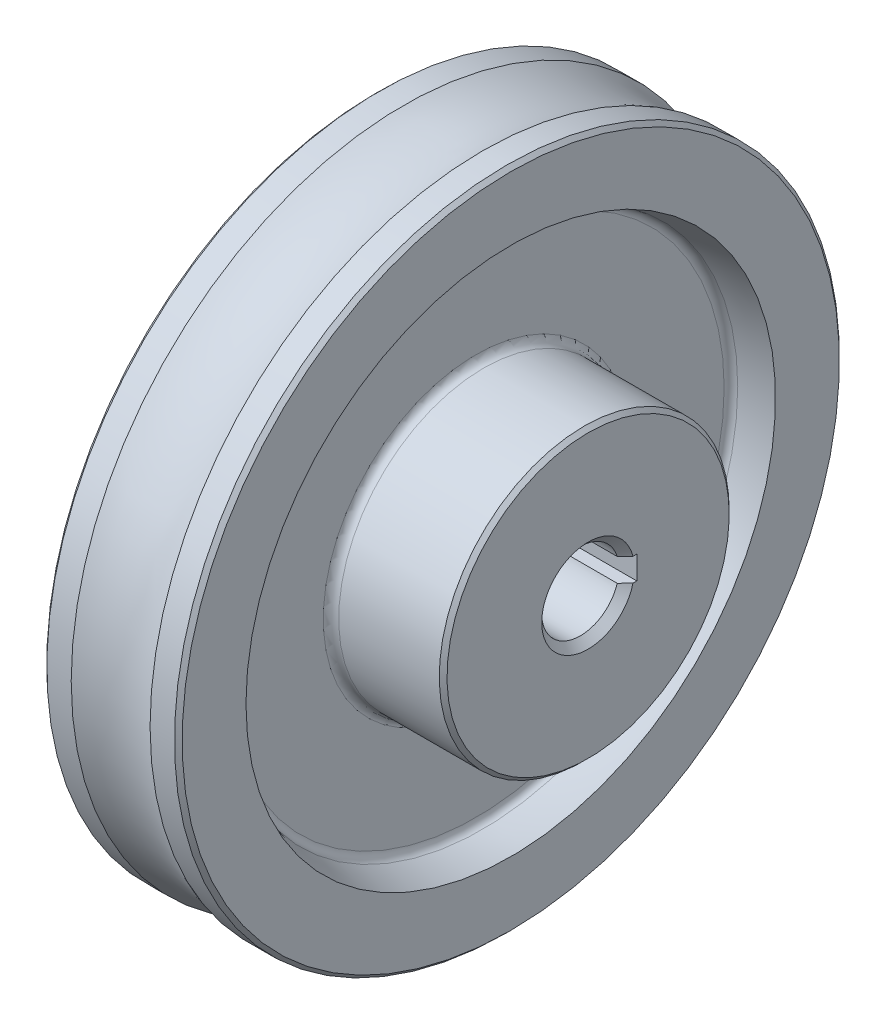
ISO-10303-21;
HEADER;
FILE_DESCRIPTION(('STEP AP214'),'2;1');
FILE_NAME('part.step','',(''),(''),'','','');
FILE_SCHEMA(('AUTOMOTIVE_DESIGN { 1 0 10303 214 1 1 1 1 }'));
ENDSEC;
DATA;
#1=APPLICATION_CONTEXT('core data for automotive mechanical design processes');
#2=APPLICATION_PROTOCOL_DEFINITION('international standard','automotive_design',2000,#1);
#3=PRODUCT_CONTEXT('',#1,'mechanical');
#4=PRODUCT('Part','Part','',(#3));
#5=PRODUCT_RELATED_PRODUCT_CATEGORY('part','',(#4));
#6=PRODUCT_DEFINITION_FORMATION('','',#4);
#7=PRODUCT_DEFINITION_CONTEXT('part definition',#1,'design');
#8=PRODUCT_DEFINITION('design','',#6,#7);
#9=PRODUCT_DEFINITION_SHAPE('','',#8);
#10=(LENGTH_UNIT() NAMED_UNIT(*) SI_UNIT(.MILLI.,.METRE.));
#11=(NAMED_UNIT(*) PLANE_ANGLE_UNIT() SI_UNIT($,.RADIAN.));
#12=(NAMED_UNIT(*) SI_UNIT($,.STERADIAN.) SOLID_ANGLE_UNIT());
#13=UNCERTAINTY_MEASURE_WITH_UNIT(LENGTH_MEASURE(1.E-05),#10,'distance_accuracy_value','');
#14=(GEOMETRIC_REPRESENTATION_CONTEXT(3) GLOBAL_UNCERTAINTY_ASSIGNED_CONTEXT((#13)) GLOBAL_UNIT_ASSIGNED_CONTEXT((#10,
#11,#12)) REPRESENTATION_CONTEXT('',''));
#15=CARTESIAN_POINT('',(0.,0.,0.));
#16=DIRECTION('',(0.,0.,1.));
#17=DIRECTION('',(1.,0.,0.));
#18=AXIS2_PLACEMENT_3D('',#15,#16,#17);
#19=CARTESIAN_POINT('',(-17.4999999999997,-1.22181724799905E-13,0.));
#20=DIRECTION('',(-1.,0.,0.));
#21=DIRECTION('',(0.,-1.,0.));
#22=AXIS2_PLACEMENT_3D('',#19,#20,#21);
#23=PLANE('',#22);
#24=CARTESIAN_POINT('',(-17.4999999999997,-1.22181724799905E-13,0.));
#25=DIRECTION('',(-1.,0.,0.));
#26=DIRECTION('',(0.,-1.,0.));
#27=AXIS2_PLACEMENT_3D('',#24,#25,#26);
#28=CIRCLE('',#27,84.9999999999998);
#29=CARTESIAN_POINT('',(-17.4999999999991,-84.9999999999999,0.));
#30=VERTEX_POINT('',#29);
#31=EDGE_CURVE('E249',#30,#30,#28,.T.);
#32=ORIENTED_EDGE('',*,*,#31,.T.);
#33=EDGE_LOOP('',(#32));
#34=FACE_BOUND('',#33,.T.);
#35=CARTESIAN_POINT('',(-17.5,0.,0.));
#36=DIRECTION('',(-1.,0.,0.));
#37=DIRECTION('',(0.,0.,1.));
#38=AXIS2_PLACEMENT_3D('',#35,#36,#37);
#39=CIRCLE('',#38,68.5);
#40=CARTESIAN_POINT('',(-17.5,0.,68.5));
#41=VERTEX_POINT('',#40);
#42=EDGE_CURVE('E324',#41,#41,#39,.T.);
#43=ORIENTED_EDGE('',*,*,#42,.F.);
#44=EDGE_LOOP('',(#43));
#45=FACE_BOUND('',#44,.T.);
#46=ADVANCED_FACE('F39',(#34,#45),#23,.T.);
#47=CARTESIAN_POINT('',(0.,0.,0.));
#48=DIRECTION('',(1.,0.,0.));
#49=DIRECTION('',(0.,1.,0.));
#50=AXIS2_PLACEMENT_3D('',#47,#48,#49);
#51=CYLINDRICAL_SURFACE('',#50,86.);
#52=CARTESIAN_POINT('',(16.5000000000004,1.151999119542E-13,0.));
#53=DIRECTION('',(1.,0.,0.));
#54=DIRECTION('',(0.,1.,0.));
#55=AXIS2_PLACEMENT_3D('',#52,#53,#54);
#56=CIRCLE('',#55,86.);
#57=CARTESIAN_POINT('',(16.4999999999998,86.0000000000001,0.));
#58=VERTEX_POINT('',#57);
#59=EDGE_CURVE('E243',#58,#58,#56,.F.);
#60=ORIENTED_EDGE('',*,*,#59,.T.);
#61=EDGE_LOOP('',(#60));
#62=FACE_BOUND('',#61,.T.);
#63=CARTESIAN_POINT('',(10.1980390271855,0.,0.));
#64=DIRECTION('',(-1.,0.,0.));
#65=DIRECTION('',(0.,0.,1.));
#66=AXIS2_PLACEMENT_3D('',#63,#64,#65);
#67=CIRCLE('',#66,86.);
#68=CARTESIAN_POINT('',(10.1980390271855,0.,86.));
#69=VERTEX_POINT('',#68);
#70=EDGE_CURVE('E225',#69,#69,#67,.T.);
#71=ORIENTED_EDGE('',*,*,#70,.F.);
#72=EDGE_LOOP('',(#71));
#73=FACE_BOUND('',#72,.T.);
#74=ADVANCED_FACE('F190',(#62,#73),#51,.T.);
#75=CARTESIAN_POINT('',(17.4999999999998,86.,0.));
#76=DIRECTION('',(1.,0.,0.));
#77=DIRECTION('',(0.,1.,0.));
#78=AXIS2_PLACEMENT_3D('',#75,#76,#77);
#79=PLANE('',#78);
#80=CARTESIAN_POINT('',(17.5000000000004,1.2218172479991E-13,0.));
#81=DIRECTION('',(1.,0.,0.));
#82=DIRECTION('',(0.,1.,0.));
#83=AXIS2_PLACEMENT_3D('',#80,#81,#82);
#84=CIRCLE('',#83,85.);
#85=CARTESIAN_POINT('',(17.4999999999998,85.0000000000001,0.));
#86=VERTEX_POINT('',#85);
#87=EDGE_CURVE('E240',#86,#86,#84,.T.);
#88=ORIENTED_EDGE('',*,*,#87,.T.);
#89=EDGE_LOOP('',(#88));
#90=FACE_BOUND('',#89,.T.);
#91=CARTESIAN_POINT('',(17.5000000000001,0.,0.));
#92=DIRECTION('',(-1.,0.,0.));
#93=DIRECTION('',(0.,0.,1.));
#94=AXIS2_PLACEMENT_3D('',#91,#92,#93);
#95=CIRCLE('',#94,68.5);
#96=CARTESIAN_POINT('',(17.5000000000001,0.,68.5));
#97=VERTEX_POINT('',#96);
#98=EDGE_CURVE('E326',#97,#97,#95,.T.);
#99=ORIENTED_EDGE('',*,*,#98,.T.);
#100=EDGE_LOOP('',(#99));
#101=FACE_BOUND('',#100,.T.);
#102=ADVANCED_FACE('F197',(#90,#101),#79,.T.);
#103=CARTESIAN_POINT('',(0.,0.,0.));
#104=DIRECTION('',(1.,0.,0.));
#105=DIRECTION('',(0.,0.,-1.));
#106=AXIS2_PLACEMENT_3D('',#103,#104,#105);
#107=TOROIDAL_SURFACE('',#106,111.,27.);
#108=ORIENTED_EDGE('',*,*,#70,.T.);
#109=EDGE_LOOP('',(#108));
#110=FACE_BOUND('',#109,.T.);
#111=CARTESIAN_POINT('',(-10.1980390271855,0.,0.));
#112=DIRECTION('',(1.,0.,0.));
#113=DIRECTION('',(0.,0.,-1.));
#114=AXIS2_PLACEMENT_3D('',#111,#112,#113);
#115=CIRCLE('',#114,86.);
#116=CARTESIAN_POINT('',(-10.1980390271855,0.,-86.));
#117=VERTEX_POINT('',#116);
#118=EDGE_CURVE('E231',#117,#117,#115,.T.);
#119=ORIENTED_EDGE('',*,*,#118,.T.);
#120=EDGE_LOOP('',(#119));
#121=FACE_BOUND('',#120,.T.);
#122=ADVANCED_FACE('F305',(#110,#121),#107,.F.);
#123=CARTESIAN_POINT('',(-16.4999999999995,-1.15199911954194E-13,0.));
#124=DIRECTION('',(-1.,0.,0.));
#125=DIRECTION('',(0.,-1.,0.));
#126=AXIS2_PLACEMENT_3D('',#123,#124,#125);
#127=CIRCLE('',#126,86.);
#128=CARTESIAN_POINT('',(-16.4999999999989,-86.0000000000001,0.));
#129=VERTEX_POINT('',#128);
#130=EDGE_CURVE('E246',#129,#129,#127,.F.);
#131=ORIENTED_EDGE('',*,*,#130,.T.);
#132=EDGE_LOOP('',(#131));
#133=FACE_BOUND('',#132,.T.);
#134=ORIENTED_EDGE('',*,*,#118,.F.);
#135=EDGE_LOOP('',(#134));
#136=FACE_BOUND('',#135,.T.);
#137=ADVANCED_FACE('F200',(#133,#136),#51,.T.);
#138=CARTESIAN_POINT('',(0.,0.,0.));
#139=DIRECTION('',(-1.,0.,0.));
#140=DIRECTION('',(0.,0.,1.));
#141=AXIS2_PLACEMENT_3D('',#138,#139,#140);
#142=TOROIDAL_SURFACE('',#141,111.,45.9619407771256);
#143=CARTESIAN_POINT('',(-10.0621528307709,0.,0.));
#144=DIRECTION('',(1.,0.,0.));
#145=DIRECTION('',(0.,0.,-1.));
#146=AXIS2_PLACEMENT_3D('',#143,#144,#145);
#147=CIRCLE('',#146,66.1530036634536);
#148=CARTESIAN_POINT('',(-10.0621528307709,0.,-66.1530036634536));
#149=VERTEX_POINT('',#148);
#150=EDGE_CURVE('E269',#149,#149,#147,.T.);
#151=ORIENTED_EDGE('',*,*,#150,.T.);
#152=EDGE_LOOP('',(#151));
#153=FACE_BOUND('',#152,.T.);
#154=ORIENTED_EDGE('',*,*,#42,.T.);
#155=EDGE_LOOP('',(#154));
#156=FACE_BOUND('',#155,.T.);
#157=ADVANCED_FACE('F289',(#153,#156),#142,.T.);
#158=CARTESIAN_POINT('',(-8.5,37.4999999999999,0.));
#159=DIRECTION('',(-1.,0.,0.));
#160=DIRECTION('',(0.,0.,1.));
#161=AXIS2_PLACEMENT_3D('',#158,#159,#160);
#162=PLANE('',#161);
#163=CARTESIAN_POINT('',(-8.5,0.,0.));
#164=DIRECTION('',(-1.,0.,0.));
#165=DIRECTION('',(0.,0.,1.));
#166=AXIS2_PLACEMENT_3D('',#163,#164,#165);
#167=CIRCLE('',#166,39.4999999999999);
#168=CARTESIAN_POINT('',(-8.5,0.,39.4999999999999));
#169=VERTEX_POINT('',#168);
#170=EDGE_CURVE('E162',#169,#169,#167,.F.);
#171=ORIENTED_EDGE('',*,*,#170,.T.);
#172=EDGE_LOOP('',(#171));
#173=FACE_BOUND('',#172,.T.);
#174=CARTESIAN_POINT('',(-8.5,0.,0.));
#175=DIRECTION('',(-1.,0.,0.));
#176=DIRECTION('',(0.,0.,1.));
#177=AXIS2_PLACEMENT_3D('',#174,#175,#176);
#178=CIRCLE('',#177,64.2015196495815);
#179=CARTESIAN_POINT('',(-8.5,0.,64.2015196495815));
#180=VERTEX_POINT('',#179);
#181=EDGE_CURVE('E266',#180,#180,#178,.T.);
#182=ORIENTED_EDGE('',*,*,#181,.T.);
#183=EDGE_LOOP('',(#182));
#184=FACE_BOUND('',#183,.T.);
#185=ADVANCED_FACE('F284',(#173,#184),#162,.T.);
#186=CARTESIAN_POINT('',(0.,0.,0.));
#187=DIRECTION('',(-1.,0.,0.));
#188=DIRECTION('',(0.,0.,1.));
#189=AXIS2_PLACEMENT_3D('',#186,#187,#188);
#190=CYLINDRICAL_SURFACE('',#189,37.4999999999999);
#191=CARTESIAN_POINT('',(-10.5,0.,0.));
#192=DIRECTION('',(-1.,0.,0.));
#193=DIRECTION('',(0.,0.,1.));
#194=AXIS2_PLACEMENT_3D('',#191,#192,#193);
#195=CIRCLE('',#194,37.4999999999999);
#196=CARTESIAN_POINT('',(-10.5,0.,37.4999999999999));
#197=VERTEX_POINT('',#196);
#198=EDGE_CURVE('E277',#197,#197,#195,.T.);
#199=ORIENTED_EDGE('',*,*,#198,.T.);
#200=EDGE_LOOP('',(#199));
#201=FACE_BOUND('',#200,.T.);
#202=CARTESIAN_POINT('',(-16.4999999999993,0.,0.));
#203=DIRECTION('',(-1.,0.,0.));
#204=DIRECTION('',(0.,0.,1.));
#205=AXIS2_PLACEMENT_3D('',#202,#203,#204);
#206=CIRCLE('',#205,37.4999999999999);
#207=CARTESIAN_POINT('',(-16.4999999999993,0.,37.4999999999999));
#208=VERTEX_POINT('',#207);
#209=EDGE_CURVE('E224',#208,#208,#206,.F.);
#210=ORIENTED_EDGE('',*,*,#209,.T.);
#211=EDGE_LOOP('',(#210));
#212=FACE_BOUND('',#211,.T.);
#213=ADVANCED_FACE('F288',(#201,#212),#190,.T.);
#214=CARTESIAN_POINT('',(8.49999999999966,37.4999999999999,0.));
#215=DIRECTION('',(1.,0.,0.));
#216=DIRECTION('',(0.,0.,-1.));
#217=AXIS2_PLACEMENT_3D('',#214,#215,#216);
#218=PLANE('',#217);
#219=CARTESIAN_POINT('',(8.49999999999966,0.,0.));
#220=DIRECTION('',(1.,0.,0.));
#221=DIRECTION('',(0.,0.,-1.));
#222=AXIS2_PLACEMENT_3D('',#219,#220,#221);
#223=CIRCLE('',#222,39.4999999999998);
#224=CARTESIAN_POINT('',(8.49999999999966,0.,-39.4999999999998));
#225=VERTEX_POINT('',#224);
#226=EDGE_CURVE('E272',#225,#225,#223,.F.);
#227=ORIENTED_EDGE('',*,*,#226,.T.);
#228=EDGE_LOOP('',(#227));
#229=FACE_BOUND('',#228,.T.);
#230=CARTESIAN_POINT('',(8.49999999999966,0.,0.));
#231=DIRECTION('',(1.,0.,0.));
#232=DIRECTION('',(0.,0.,-1.));
#233=AXIS2_PLACEMENT_3D('',#230,#231,#232);
#234=CIRCLE('',#233,64.2015196495815);
#235=CARTESIAN_POINT('',(8.49999999999966,0.,-64.2015196495815));
#236=VERTEX_POINT('',#235);
#237=EDGE_CURVE('E263',#236,#236,#234,.T.);
#238=ORIENTED_EDGE('',*,*,#237,.T.);
#239=EDGE_LOOP('',(#238));
#240=FACE_BOUND('',#239,.T.);
#241=ADVANCED_FACE('F214',(#229,#240),#218,.T.);
#242=CARTESIAN_POINT('',(0.,0.,0.));
#243=DIRECTION('',(-1.,0.,0.));
#244=DIRECTION('',(0.,0.,1.));
#245=AXIS2_PLACEMENT_3D('',#242,#243,#244);
#246=TOROIDAL_SURFACE('',#245,111.,45.9619407771256);
#247=CARTESIAN_POINT('',(10.0621528307705,0.,0.));
#248=DIRECTION('',(-1.,0.,0.));
#249=DIRECTION('',(0.,0.,1.));
#250=AXIS2_PLACEMENT_3D('',#247,#248,#249);
#251=CIRCLE('',#250,66.1530036634535);
#252=CARTESIAN_POINT('',(10.0621528307705,0.,66.1530036634535));
#253=VERTEX_POINT('',#252);
#254=EDGE_CURVE('E260',#253,#253,#251,.T.);
#255=ORIENTED_EDGE('',*,*,#254,.T.);
#256=EDGE_LOOP('',(#255));
#257=FACE_BOUND('',#256,.T.);
#258=ORIENTED_EDGE('',*,*,#98,.F.);
#259=EDGE_LOOP('',(#258));
#260=FACE_BOUND('',#259,.T.);
#261=ADVANCED_FACE('F205',(#257,#260),#246,.T.);
#262=DIRECTION('',(0.,0.,1.));
#263=VECTOR('',#262,1.);
#264=CARTESIAN_POINT('',(-17.4999999999997,3.,-12.6));
#265=LINE('',#264,#263);
#266=CARTESIAN_POINT('',(-17.4999999999997,3.,-12.6));
#267=VERTEX_POINT('',#266);
#268=CARTESIAN_POINT('',(-17.4999999999997,3.,-11.6189500386211));
#269=VERTEX_POINT('',#268);
#270=EDGE_CURVE('E101',#267,#269,#265,.T.);
#271=ORIENTED_EDGE('',*,*,#270,.T.);
#272=CARTESIAN_POINT('',(-17.4999999999997,-4.8377844246308E-13,0.));
#273=DIRECTION('',(-1.,0.,0.));
#274=DIRECTION('',(0.,-1.,0.));
#275=AXIS2_PLACEMENT_3D('',#272,#273,#274);
#276=CIRCLE('',#275,11.999999999999);
#277=CARTESIAN_POINT('',(-17.4999999999997,-3.,-11.6189500386214));
#278=VERTEX_POINT('',#277);
#279=EDGE_CURVE('E251',#269,#278,#276,.F.);
#280=ORIENTED_EDGE('',*,*,#279,.T.);
#281=DIRECTION('',(0.,0.,-1.));
#282=VECTOR('',#281,1.);
#283=CARTESIAN_POINT('',(-17.4999999999997,-3.,-12.6));
#284=LINE('',#283,#282);
#285=CARTESIAN_POINT('',(-17.4999999999997,-3.,-12.6));
#286=VERTEX_POINT('',#285);
#287=EDGE_CURVE('E125',#278,#286,#284,.T.);
#288=ORIENTED_EDGE('',*,*,#287,.T.);
#289=DIRECTION('',(0.,1.,0.));
#290=VECTOR('',#289,1.);
#291=CARTESIAN_POINT('',(-17.4999999999997,0.,-12.6));
#292=LINE('',#291,#290);
#293=EDGE_CURVE('E104',#286,#267,#292,.T.);
#294=ORIENTED_EDGE('',*,*,#293,.T.);
#295=EDGE_LOOP('',(#271,#280,#288,#294));
#296=FACE_BOUND('',#295,.T.);
#297=CARTESIAN_POINT('',(-17.4999999999997,0.,0.));
#298=DIRECTION('',(-1.,0.,0.));
#299=DIRECTION('',(0.,-1.,0.));
#300=AXIS2_PLACEMENT_3D('',#297,#298,#299);
#301=CIRCLE('',#300,36.4999999999995);
#302=CARTESIAN_POINT('',(-17.4999999999994,-36.4999999999995,0.));
#303=VERTEX_POINT('',#302);
#304=EDGE_CURVE('E222',#303,#303,#301,.T.);
#305=ORIENTED_EDGE('',*,*,#304,.T.);
#306=EDGE_LOOP('',(#305));
#307=FACE_BOUND('',#306,.T.);
#308=ADVANCED_FACE('F193',(#296,#307),#23,.T.);
#309=CARTESIAN_POINT('',(37.4999999999999,37.5,0.));
#310=DIRECTION('',(1.,0.,0.));
#311=DIRECTION('',(0.,1.,0.));
#312=AXIS2_PLACEMENT_3D('',#309,#310,#311);
#313=PLANE('',#312);
#314=DIRECTION('',(0.,0.,1.));
#315=VECTOR('',#314,1.);
#316=CARTESIAN_POINT('',(37.5000000000001,3.,-12.6));
#317=LINE('',#316,#315);
#318=CARTESIAN_POINT('',(37.5000000000001,3.,-12.6));
#319=VERTEX_POINT('',#318);
#320=CARTESIAN_POINT('',(37.5000000000001,3.,-11.6189500386223));
#321=VERTEX_POINT('',#320);
#322=EDGE_CURVE('E99',#319,#321,#317,.T.);
#323=ORIENTED_EDGE('',*,*,#322,.F.);
#324=DIRECTION('',(0.,1.,0.));
#325=VECTOR('',#324,1.);
#326=CARTESIAN_POINT('',(37.5000000000001,0.,-12.6));
#327=LINE('',#326,#325);
#328=CARTESIAN_POINT('',(37.5000000000002,-3.,-12.6));
#329=VERTEX_POINT('',#328);
#330=EDGE_CURVE('E108',#329,#319,#327,.T.);
#331=ORIENTED_EDGE('',*,*,#330,.F.);
#332=DIRECTION('',(0.,0.,-1.));
#333=VECTOR('',#332,1.);
#334=CARTESIAN_POINT('',(37.5000000000002,-3.,-12.6));
#335=LINE('',#334,#333);
#336=CARTESIAN_POINT('',(37.5000000000002,-3.,-11.6189500386224));
#337=VERTEX_POINT('',#336);
#338=EDGE_CURVE('E114',#337,#329,#335,.T.);
#339=ORIENTED_EDGE('',*,*,#338,.F.);
#340=CARTESIAN_POINT('',(37.5000000000001,0.,0.));
#341=DIRECTION('',(1.,0.,0.));
#342=DIRECTION('',(0.,1.,0.));
#343=AXIS2_PLACEMENT_3D('',#340,#341,#342);
#344=CIRCLE('',#343,12.0000000000001);
#345=EDGE_CURVE('E120',#337,#321,#344,.F.);
#346=ORIENTED_EDGE('',*,*,#345,.T.);
#347=EDGE_LOOP('',(#323,#331,#339,#346));
#348=FACE_BOUND('',#347,.T.);
#349=CARTESIAN_POINT('',(37.5000000000001,2.61817981714087E-13,0.));
#350=DIRECTION('',(1.,0.,0.));
#351=DIRECTION('',(0.,1.,0.));
#352=AXIS2_PLACEMENT_3D('',#349,#350,#351);
#353=CIRCLE('',#352,36.4999999999999);
#354=CARTESIAN_POINT('',(37.4999999999999,36.5000000000001,0.));
#355=VERTEX_POINT('',#354);
#356=EDGE_CURVE('E228',#355,#355,#353,.T.);
#357=ORIENTED_EDGE('',*,*,#356,.T.);
#358=EDGE_LOOP('',(#357));
#359=FACE_BOUND('',#358,.T.);
#360=ADVANCED_FACE('F117',(#348,#359),#313,.T.);
#361=CARTESIAN_POINT('',(0.,0.,0.));
#362=DIRECTION('',(1.,0.,0.));
#363=DIRECTION('',(0.,1.,0.));
#364=AXIS2_PLACEMENT_3D('',#361,#362,#363);
#365=CYLINDRICAL_SURFACE('',#364,37.4999999999998);
#366=CARTESIAN_POINT('',(10.4999999999997,0.,0.));
#367=DIRECTION('',(1.,0.,0.));
#368=DIRECTION('',(0.,0.,-1.));
#369=AXIS2_PLACEMENT_3D('',#366,#367,#368);
#370=CIRCLE('',#369,37.4999999999998);
#371=CARTESIAN_POINT('',(10.4999999999997,0.,-37.4999999999998));
#372=VERTEX_POINT('',#371);
#373=EDGE_CURVE('E275',#372,#372,#370,.T.);
#374=ORIENTED_EDGE('',*,*,#373,.T.);
#375=EDGE_LOOP('',(#374));
#376=FACE_BOUND('',#375,.T.);
#377=CARTESIAN_POINT('',(36.5000000000002,2.54836168868378E-13,0.));
#378=DIRECTION('',(1.,0.,0.));
#379=DIRECTION('',(0.,1.,0.));
#380=AXIS2_PLACEMENT_3D('',#377,#378,#379);
#381=CIRCLE('',#380,37.4999999999998);
#382=CARTESIAN_POINT('',(36.4999999999999,37.5000000000001,0.));
#383=VERTEX_POINT('',#382);
#384=EDGE_CURVE('E237',#383,#383,#381,.F.);
#385=ORIENTED_EDGE('',*,*,#384,.T.);
#386=EDGE_LOOP('',(#385));
#387=FACE_BOUND('',#386,.T.);
#388=ADVANCED_FACE('F211',(#376,#387),#365,.T.);
#389=CARTESIAN_POINT('',(-17.5000000000006,-4.83778442463086E-13,0.));
#390=DIRECTION('',(1.,0.,0.));
#391=DIRECTION('',(0.,1.,0.));
#392=AXIS2_PLACEMENT_3D('',#389,#390,#391);
#393=CYLINDRICAL_SURFACE('',#392,10.);
#394=CARTESIAN_POINT('',(-15.5000000000007,-4.69814816771669E-13,0.));
#395=DIRECTION('',(-1.,0.,0.));
#396=DIRECTION('',(0.,-1.,0.));
#397=AXIS2_PLACEMENT_3D('',#394,#395,#396);
#398=CIRCLE('',#397,10.);
#399=CARTESIAN_POINT('',(-15.5000000000005,-2.99999999999996,-9.53939201416947));
#400=VERTEX_POINT('',#399);
#401=CARTESIAN_POINT('',(-15.5000000000006,3.,-9.53939201416931));
#402=VERTEX_POINT('',#401);
#403=EDGE_CURVE('E256',#400,#402,#398,.T.);
#404=ORIENTED_EDGE('',*,*,#403,.T.);
#405=DIRECTION('',(1.,0.,0.));
#406=VECTOR('',#405,1.);
#407=CARTESIAN_POINT('',(-24.2355267977291,3.,-9.53939201416931));
#408=LINE('',#407,#406);
#409=CARTESIAN_POINT('',(35.5,3.,-9.53939201416931));
#410=VERTEX_POINT('',#409);
#411=EDGE_CURVE('E129',#402,#410,#408,.T.);
#412=ORIENTED_EDGE('',*,*,#411,.T.);
#413=CARTESIAN_POINT('',(35.5,-1.13742361640507E-13,0.));
#414=DIRECTION('',(1.,0.,0.));
#415=DIRECTION('',(0.,1.,0.));
#416=AXIS2_PLACEMENT_3D('',#413,#414,#415);
#417=CIRCLE('',#416,10.);
#418=CARTESIAN_POINT('',(35.5000000000001,-3.,-9.53939201416949));
#419=VERTEX_POINT('',#418);
#420=EDGE_CURVE('E253',#410,#419,#417,.T.);
#421=ORIENTED_EDGE('',*,*,#420,.T.);
#422=DIRECTION('',(1.,0.,0.));
#423=VECTOR('',#422,1.);
#424=CARTESIAN_POINT('',(-24.2355267977291,-2.99999999999996,-9.53939201416947));
#425=LINE('',#424,#423);
#426=EDGE_CURVE('E60',#400,#419,#425,.T.);
#427=ORIENTED_EDGE('',*,*,#426,.F.);
#428=EDGE_LOOP('',(#404,#412,#421,#427));
#429=FACE_BOUND('',#428,.T.);
#430=ADVANCED_FACE('F311',(#429),#393,.F.);
#431=CARTESIAN_POINT('',(-17.4999999999997,0.,0.));
#432=DIRECTION('',(1.,0.,0.));
#433=DIRECTION('',(0.,0.,-1.));
#434=AXIS2_PLACEMENT_3D('',#431,#432,#433);
#435=CONICAL_SURFACE('',#434,36.4999999999995,0.785398163397445);
#436=ORIENTED_EDGE('',*,*,#209,.F.);
#437=EDGE_LOOP('',(#436));
#438=FACE_BOUND('',#437,.T.);
#439=ORIENTED_EDGE('',*,*,#304,.F.);
#440=EDGE_LOOP('',(#439));
#441=FACE_BOUND('',#440,.T.);
#442=ADVANCED_FACE('F361',(#438,#441),#435,.T.);
#443=CARTESIAN_POINT('',(37.5000000000001,2.61817981714087E-13,0.));
#444=DIRECTION('',(-1.,0.,0.));
#445=DIRECTION('',(0.,-1.,0.));
#446=AXIS2_PLACEMENT_3D('',#443,#444,#445);
#447=CONICAL_SURFACE('',#446,36.4999999999999,0.785398163397431);
#448=ORIENTED_EDGE('',*,*,#384,.F.);
#449=EDGE_LOOP('',(#448));
#450=FACE_BOUND('',#449,.T.);
#451=ORIENTED_EDGE('',*,*,#356,.F.);
#452=EDGE_LOOP('',(#451));
#453=FACE_BOUND('',#452,.T.);
#454=ADVANCED_FACE('F345',(#450,#453),#447,.T.);
#455=CARTESIAN_POINT('',(17.5000000000004,1.2218172479991E-13,0.));
#456=DIRECTION('',(-1.,0.,0.));
#457=DIRECTION('',(0.,-1.,0.));
#458=AXIS2_PLACEMENT_3D('',#455,#456,#457);
#459=CONICAL_SURFACE('',#458,85.,0.785398163397431);
#460=ORIENTED_EDGE('',*,*,#59,.F.);
#461=EDGE_LOOP('',(#460));
#462=FACE_BOUND('',#461,.T.);
#463=ORIENTED_EDGE('',*,*,#87,.F.);
#464=EDGE_LOOP('',(#463));
#465=FACE_BOUND('',#464,.T.);
#466=ADVANCED_FACE('F337',(#462,#465),#459,.T.);
#467=CARTESIAN_POINT('',(-16.4999999999995,-1.15199911954194E-13,0.));
#468=DIRECTION('',(1.,0.,0.));
#469=DIRECTION('',(0.,1.,0.));
#470=AXIS2_PLACEMENT_3D('',#467,#468,#469);
#471=CONICAL_SURFACE('',#470,86.,0.785398163397452);
#472=ORIENTED_EDGE('',*,*,#31,.F.);
#473=EDGE_LOOP('',(#472));
#474=FACE_BOUND('',#473,.T.);
#475=ORIENTED_EDGE('',*,*,#130,.F.);
#476=EDGE_LOOP('',(#475));
#477=FACE_BOUND('',#476,.T.);
#478=ADVANCED_FACE('F335',(#474,#477),#471,.T.);
#479=CARTESIAN_POINT('',(-17.4999999999997,-4.8377844246308E-13,0.));
#480=DIRECTION('',(-1.,0.,0.));
#481=DIRECTION('',(0.,-1.,0.));
#482=AXIS2_PLACEMENT_3D('',#479,#480,#481);
#483=CONICAL_SURFACE('',#482,11.999999999999,0.785398163397443);
#484=CARTESIAN_POINT('',(-12.5395435650677,3.,-6.36829440309371));
#485=CARTESIAN_POINT('',(-12.6548635469354,3.,-6.49576399618474));
#486=CARTESIAN_POINT('',(-12.7705228957125,3.,-6.62292559841588));
#487=CARTESIAN_POINT('',(-13.0024303663799,3.,-6.87670951087112));
#488=CARTESIAN_POINT('',(-13.1186784847372,3.,-7.00333182432303));
#489=CARTESIAN_POINT('',(-13.4681676033729,3.,-7.3825011488684));
#490=CARTESIAN_POINT('',(-13.7021588515722,3.,-7.6343565895894));
#491=CARTESIAN_POINT('',(-14.1716270105932,3.,-8.13665001506201));
#492=CARTESIAN_POINT('',(-14.4071038363906,3.,-8.38708807940577));
#493=CARTESIAN_POINT('',(-14.8792191489909,3.,-8.88686943839402));
#494=CARTESIAN_POINT('',(-15.1158576438378,3.,-9.13621272543503));
#495=CARTESIAN_POINT('',(-15.8270852584423,3.,-9.88290601016958));
#496=CARTESIAN_POINT('',(-16.3030292763947,3.,-10.3789649900353));
#497=CARTESIAN_POINT('',(-17.2572612995376,3.,-11.3688328502395));
#498=CARTESIAN_POINT('',(-17.7355493384813,3.,-11.862641697978));
#499=CARTESIAN_POINT('',(-18.4188548741597,3.,-12.5657963828594));
#500=CARTESIAN_POINT('',(-18.6232071130599,3.,-12.775789191334));
#501=CARTESIAN_POINT('',(-19.0321682553342,3.,-13.1955225974471));
#502=CARTESIAN_POINT('',(-19.2367771573506,3.,-13.4052631964085));
#503=CARTESIAN_POINT('',(-19.6462250338452,3.,-13.8245331890615));
#504=CARTESIAN_POINT('',(-19.8510640156938,3.,-14.0340625755541));
#505=CARTESIAN_POINT('',(-20.2609395777755,3.,-14.4529301268378));
#506=CARTESIAN_POINT('',(-20.4659761590281,3.,-14.6622682906314));
#507=CARTESIAN_POINT('',(-20.6710976110752,3.,-14.8715232146793));
#508=B_SPLINE_CURVE_WITH_KNOTS('',3,(#484,#485,#486,#487,#488,#489,#490,#491,#492,#493,#494,
#495,#496,#497,#498,#499,#500,#501,#502,#503,#504,#505,#506,#507),.UNSPECIFIED.,.F.,.F.,(4,2,2,
2,2,2,2,2,2,2,2,4),(0.,0.515677223395593,1.03135135594506,2.06267513451471,3.0939404131956,
4.12521284296523,6.18757024515083,8.24995743241654,9.12899728234994,10.0080325014775,
10.8870967319472,11.7661655223364),.UNSPECIFIED.);
#509=EDGE_CURVE('E68',#402,#269,#508,.T.);
#510=ORIENTED_EDGE('',*,*,#509,.F.);
#511=ORIENTED_EDGE('',*,*,#403,.F.);
#512=CARTESIAN_POINT('',(-20.6710976110751,-3.,-14.8715232146795));
#513=CARTESIAN_POINT('',(-20.3279165679451,-3.,-14.5214148687785));
#514=CARTESIAN_POINT('',(-19.9849633978241,-3.,-14.1710826432724));
#515=CARTESIAN_POINT('',(-19.2996614829752,-3.,-13.4698291478946));
#516=CARTESIAN_POINT('',(-18.9573127368827,-3.,-13.1189078793562));
#517=CARTESIAN_POINT('',(-18.2733925119417,-3.,-12.4163598469431));
#518=CARTESIAN_POINT('',(-17.9318209765805,-3.,-12.0647331381042));
#519=CARTESIAN_POINT('',(-17.2496459172957,-3.,-11.360538282732));
#520=CARTESIAN_POINT('',(-16.9090423979053,-3.,-11.0079701318049));
#521=CARTESIAN_POINT('',(-16.2290859585387,-3.,-10.3015753144762));
#522=CARTESIAN_POINT('',(-15.889733140233,-3.,-9.94774855016325));
#523=CARTESIAN_POINT('',(-15.2127583130769,-3.,-9.23844864047475));
#524=CARTESIAN_POINT('',(-14.8751362834152,-3.,-8.88297551499364));
#525=CARTESIAN_POINT('',(-14.3705172737271,-3.,-8.34802670273378));
#526=CARTESIAN_POINT('',(-14.2026063930913,-3.,-8.16941318041264));
#527=CARTESIAN_POINT('',(-13.867525105698,-3.,-7.81149384597688));
#528=CARTESIAN_POINT('',(-13.700354696202,-3.,-7.63218803642707));
#529=CARTESIAN_POINT('',(-13.3669034908264,-3.,-7.27273684264354));
#530=CARTESIAN_POINT('',(-13.2006227308103,-3.,-7.09259142510323));
#531=CARTESIAN_POINT('',(-12.8691836820374,-3.,-6.73126712887224));
#532=CARTESIAN_POINT('',(-12.7040254076668,-3.,-6.55008823699068));
#533=CARTESIAN_POINT('',(-12.5395435650676,-3.,-6.36829440309399));
#534=B_SPLINE_CURVE_WITH_KNOTS('',3,(#512,#513,#514,#515,#516,#517,#518,#519,#520,#521,#522,
#523,#524,#525,#526,#527,#528,#529,#530,#531,#532,#533),.UNSPECIFIED.,.F.,.F.,(4,2,2,2,2,2,2,2,
2,2,4),(0.,1.47076275001074,2.94152217491768,4.41217100226491,5.88282670547312,7.35359943300994,
8.82435443401125,9.5597925604891,10.2952279648926,11.0306927960534,11.7661670355096),.UNSPECIFIED.);
#535=EDGE_CURVE('E131',#278,#400,#534,.T.);
#536=ORIENTED_EDGE('',*,*,#535,.F.);
#537=ORIENTED_EDGE('',*,*,#279,.F.);
#538=EDGE_LOOP('',(#510,#511,#536,#537));
#539=FACE_BOUND('',#538,.T.);
#540=ADVANCED_FACE('F148',(#539),#483,.F.);
#541=CARTESIAN_POINT('',(35.5,-1.13742361640507E-13,0.));
#542=DIRECTION('',(1.,0.,0.));
#543=DIRECTION('',(0.,1.,0.));
#544=AXIS2_PLACEMENT_3D('',#541,#542,#543);
#545=CONICAL_SURFACE('',#544,10.,0.785398163397447);
#546=CARTESIAN_POINT('',(40.6710976110772,3.,-14.8715232146821));
#547=CARTESIAN_POINT('',(40.327916567947,3.,-14.521414868781));
#548=CARTESIAN_POINT('',(39.9849633978258,3.,-14.1710826432748));
#549=CARTESIAN_POINT('',(39.2996614829766,3.,-13.4698291478965));
#550=CARTESIAN_POINT('',(38.9573127368839,3.,-13.118907879358));
#551=CARTESIAN_POINT('',(38.2733925119426,3.,-12.4163598469445));
#552=CARTESIAN_POINT('',(37.9318209765812,3.,-12.0647331381054));
#553=CARTESIAN_POINT('',(37.249645917296,3.,-11.3605382827329));
#554=CARTESIAN_POINT('',(36.9090423979055,3.,-11.0079701318056));
#555=CARTESIAN_POINT('',(36.2290859585385,3.,-10.3015753144765));
#556=CARTESIAN_POINT('',(35.8897331402326,3.,-9.94774855016338));
#557=CARTESIAN_POINT('',(35.2127583130762,3.,-9.2384486404745));
#558=CARTESIAN_POINT('',(34.8751362834144,3.,-8.8829755149932));
#559=CARTESIAN_POINT('',(34.370517273726,3.,-8.34802670273305));
#560=CARTESIAN_POINT('',(34.2026063930902,3.,-8.16941318041182));
#561=CARTESIAN_POINT('',(33.8675251056966,3.,-7.81149384597587));
#562=CARTESIAN_POINT('',(33.7003546962005,3.,-7.63218803642597));
#563=CARTESIAN_POINT('',(33.3669034908248,3.,-7.27273684264224));
#564=CARTESIAN_POINT('',(33.2006227308087,3.,-7.09259142510184));
#565=CARTESIAN_POINT('',(32.8691836820356,3.,-6.73126712887065));
#566=CARTESIAN_POINT('',(32.7040254076649,3.,-6.55008823698899));
#567=CARTESIAN_POINT('',(32.5395435650656,3.,-6.36829440309219));
#568=B_SPLINE_CURVE_WITH_KNOTS('',3,(#546,#547,#548,#549,#550,#551,#552,#553,#554,#555,#556,
#557,#558,#559,#560,#561,#562,#563,#564,#565,#566,#567),.UNSPECIFIED.,.F.,.F.,(4,2,2,2,2,2,2,2,
2,2,4),(0.,1.4707627500115,2.94152217491919,4.41217100226717,5.88282670547614,7.35359943301371,
8.82435443401578,9.559792560494,10.2952279648979,11.030692796059,11.7661670355156),.UNSPECIFIED.);
#569=EDGE_CURVE('E11',#321,#410,#568,.T.);
#570=ORIENTED_EDGE('',*,*,#569,.F.);
#571=ORIENTED_EDGE('',*,*,#345,.F.);
#572=CARTESIAN_POINT('',(32.5395435650658,-3.,-6.36829440309247));
#573=CARTESIAN_POINT('',(32.6548635469334,-3.,-6.49576399618349));
#574=CARTESIAN_POINT('',(32.7705228957105,-3.,-6.6229255984146));
#575=CARTESIAN_POINT('',(33.0024303663779,-3.,-6.87670951086979));
#576=CARTESIAN_POINT('',(33.1186784847352,-3.,-7.00333182432168));
#577=CARTESIAN_POINT('',(33.4681676033707,-3.,-7.38250114886698));
#578=CARTESIAN_POINT('',(33.70215885157,-3.,-7.63435658958793));
#579=CARTESIAN_POINT('',(34.1716270105909,-3.,-8.13665001506044));
#580=CARTESIAN_POINT('',(34.4071038363883,-3.,-8.38708807940415));
#581=CARTESIAN_POINT('',(34.8792191489885,-3.,-8.88686943839231));
#582=CARTESIAN_POINT('',(35.1158576438353,-3.,-9.13621272543327));
#583=CARTESIAN_POINT('',(35.8270852584397,-3.,-9.88290601016767));
#584=CARTESIAN_POINT('',(36.3030292763919,-3.,-10.3789649900333));
#585=CARTESIAN_POINT('',(37.2572612995347,-3.,-11.3688328502373));
#586=CARTESIAN_POINT('',(37.7355493384783,-3.,-11.8626416979757));
#587=CARTESIAN_POINT('',(38.418854874157,-3.,-12.5657963828574));
#588=CARTESIAN_POINT('',(38.6232071130576,-3.,-12.7757891913324));
#589=CARTESIAN_POINT('',(39.0321682553328,-3.,-13.1955225974464));
#590=CARTESIAN_POINT('',(39.2367771573496,-3.,-13.4052631964082));
#591=CARTESIAN_POINT('',(39.646225033845,-3.,-13.824533189062));
#592=CARTESIAN_POINT('',(39.851064015694,-3.,-14.0340625755551));
#593=CARTESIAN_POINT('',(40.2609395777765,-3.,-14.4529301268397));
#594=CARTESIAN_POINT('',(40.4659761590295,-3.,-14.6622682906337));
#595=CARTESIAN_POINT('',(40.671097611077,-3.,-14.871523214682));
#596=B_SPLINE_CURVE_WITH_KNOTS('',3,(#572,#573,#574,#575,#576,#577,#578,#579,#580,#581,#582,
#583,#584,#585,#586,#587,#588,#589,#590,#591,#592,#593,#594,#595),.UNSPECIFIED.,.F.,.F.,(4,2,2,
2,2,2,2,2,2,2,2,4),(0.,0.515677223395498,1.03135135594487,2.06267513451431,3.093940413195,
4.12521284296443,6.18757024514962,8.24995743241493,9.12899728235009,10.0080325014795,
10.8870967319509,11.7661655223419),.UNSPECIFIED.);
#597=EDGE_CURVE('E53',#419,#337,#596,.T.);
#598=ORIENTED_EDGE('',*,*,#597,.F.);
#599=ORIENTED_EDGE('',*,*,#420,.F.);
#600=EDGE_LOOP('',(#570,#571,#598,#599));
#601=FACE_BOUND('',#600,.T.);
#602=ADVANCED_FACE('F165',(#601),#545,.F.);
#603=CARTESIAN_POINT('',(10.4999999999997,0.,0.));
#604=DIRECTION('',(-1.,0.,0.));
#605=DIRECTION('',(0.,0.,1.));
#606=AXIS2_PLACEMENT_3D('',#603,#604,#605);
#607=TOROIDAL_SURFACE('',#606,64.2015196495815,2.);
#608=ORIENTED_EDGE('',*,*,#237,.F.);
#609=EDGE_LOOP('',(#608));
#610=FACE_BOUND('',#609,.T.);
#611=ORIENTED_EDGE('',*,*,#254,.F.);
#612=EDGE_LOOP('',(#611));
#613=FACE_BOUND('',#612,.T.);
#614=ADVANCED_FACE('F171',(#610,#613),#607,.F.);
#615=CARTESIAN_POINT('',(-10.5,0.,0.));
#616=DIRECTION('',(1.,0.,0.));
#617=DIRECTION('',(0.,0.,-1.));
#618=AXIS2_PLACEMENT_3D('',#615,#616,#617);
#619=TOROIDAL_SURFACE('',#618,64.2015196495815,2.);
#620=ORIENTED_EDGE('',*,*,#150,.F.);
#621=EDGE_LOOP('',(#620));
#622=FACE_BOUND('',#621,.T.);
#623=ORIENTED_EDGE('',*,*,#181,.F.);
#624=EDGE_LOOP('',(#623));
#625=FACE_BOUND('',#624,.T.);
#626=ADVANCED_FACE('F176',(#622,#625),#619,.F.);
#627=CARTESIAN_POINT('',(10.4999999999997,0.,0.));
#628=DIRECTION('',(1.,0.,0.));
#629=DIRECTION('',(0.,0.,-1.));
#630=AXIS2_PLACEMENT_3D('',#627,#628,#629);
#631=TOROIDAL_SURFACE('',#630,39.4999999999998,2.);
#632=ORIENTED_EDGE('',*,*,#373,.F.);
#633=EDGE_LOOP('',(#632));
#634=FACE_BOUND('',#633,.T.);
#635=ORIENTED_EDGE('',*,*,#226,.F.);
#636=EDGE_LOOP('',(#635));
#637=FACE_BOUND('',#636,.T.);
#638=ADVANCED_FACE('F179',(#634,#637),#631,.F.);
#639=CARTESIAN_POINT('',(-10.5,0.,0.));
#640=DIRECTION('',(-1.,0.,0.));
#641=DIRECTION('',(0.,0.,1.));
#642=AXIS2_PLACEMENT_3D('',#639,#640,#641);
#643=TOROIDAL_SURFACE('',#642,39.4999999999999,2.);
#644=ORIENTED_EDGE('',*,*,#170,.F.);
#645=EDGE_LOOP('',(#644));
#646=FACE_BOUND('',#645,.T.);
#647=ORIENTED_EDGE('',*,*,#198,.F.);
#648=EDGE_LOOP('',(#647));
#649=FACE_BOUND('',#648,.T.);
#650=ADVANCED_FACE('F41',(#646,#649),#643,.F.);
#651=CARTESIAN_POINT('',(-24.2355267977291,0.,-12.6));
#652=DIRECTION('',(0.,0.,-1.));
#653=DIRECTION('',(0.,1.,0.));
#654=AXIS2_PLACEMENT_3D('',#651,#652,#653);
#655=PLANE('',#654);
#656=DIRECTION('',(1.,0.,0.));
#657=VECTOR('',#656,1.);
#658=CARTESIAN_POINT('',(-24.2355267977291,-3.,-12.6));
#659=LINE('',#658,#657);
#660=EDGE_CURVE('E111',#286,#329,#659,.T.);
#661=ORIENTED_EDGE('',*,*,#660,.T.);
#662=ORIENTED_EDGE('',*,*,#330,.T.);
#663=DIRECTION('',(1.,0.,0.));
#664=VECTOR('',#663,1.);
#665=CARTESIAN_POINT('',(-24.2355267977291,3.,-12.6));
#666=LINE('',#665,#664);
#667=EDGE_CURVE('E95',#267,#319,#666,.T.);
#668=ORIENTED_EDGE('',*,*,#667,.F.);
#669=ORIENTED_EDGE('',*,*,#293,.F.);
#670=EDGE_LOOP('',(#661,#662,#668,#669));
#671=FACE_BOUND('',#670,.T.);
#672=ADVANCED_FACE('F109',(#671),#655,.F.);
#673=CARTESIAN_POINT('',(-24.2355267977291,3.,-12.6));
#674=DIRECTION('',(0.,1.,0.));
#675=DIRECTION('',(0.,0.,1.));
#676=AXIS2_PLACEMENT_3D('',#673,#674,#675);
#677=PLANE('',#676);
#678=ORIENTED_EDGE('',*,*,#509,.T.);
#679=ORIENTED_EDGE('',*,*,#270,.F.);
#680=ORIENTED_EDGE('',*,*,#667,.T.);
#681=ORIENTED_EDGE('',*,*,#322,.T.);
#682=ORIENTED_EDGE('',*,*,#569,.T.);
#683=ORIENTED_EDGE('',*,*,#411,.F.);
#684=EDGE_LOOP('',(#678,#679,#680,#681,#682,#683));
#685=FACE_BOUND('',#684,.T.);
#686=ADVANCED_FACE('F97',(#685),#677,.F.);
#687=CARTESIAN_POINT('',(-24.2355267977291,-3.,-12.6));
#688=DIRECTION('',(0.,-1.,0.));
#689=DIRECTION('',(0.,0.,-1.));
#690=AXIS2_PLACEMENT_3D('',#687,#688,#689);
#691=PLANE('',#690);
#692=ORIENTED_EDGE('',*,*,#535,.T.);
#693=ORIENTED_EDGE('',*,*,#426,.T.);
#694=ORIENTED_EDGE('',*,*,#597,.T.);
#695=ORIENTED_EDGE('',*,*,#338,.T.);
#696=ORIENTED_EDGE('',*,*,#660,.F.);
#697=ORIENTED_EDGE('',*,*,#287,.F.);
#698=EDGE_LOOP('',(#692,#693,#694,#695,#696,#697));
#699=FACE_BOUND('',#698,.T.);
#700=ADVANCED_FACE('F151',(#699),#691,.F.);
#701=CLOSED_SHELL('',(#46,#74,#102,#122,#137,#157,#185,#213,#241,#261,#308,#360,#388,#430,#442,
#454,#466,#478,#540,#602,#614,#626,#638,#650,#672,#686,#700));
#702=MANIFOLD_SOLID_BREP('B2',#701);
#703=ADVANCED_BREP_SHAPE_REPRESENTATION('',(#18,#702),#14);
#704=SHAPE_DEFINITION_REPRESENTATION(#9,#703);
ENDSEC;
END-ISO-10303-21;
